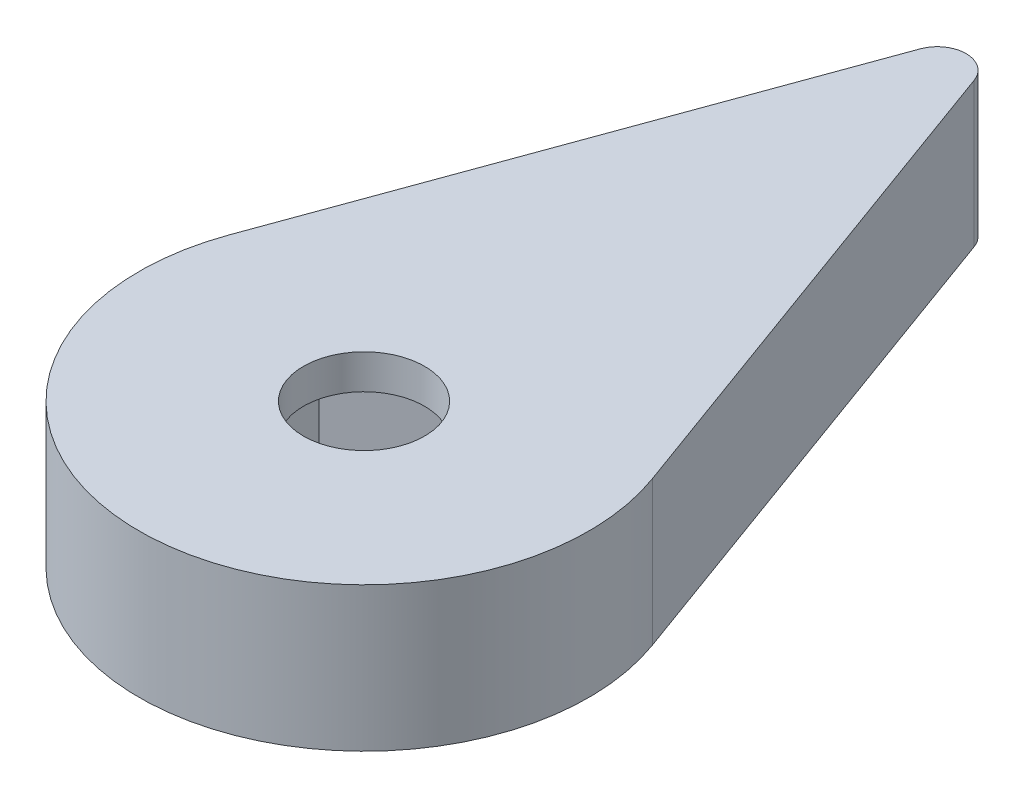
ISO-10303-21;
HEADER;
FILE_DESCRIPTION(('STEP AP214'),'2;1');
FILE_NAME('part.step','',(''),(''),'','','');
FILE_SCHEMA(('AUTOMOTIVE_DESIGN { 1 0 10303 214 1 1 1 1 }'));
ENDSEC;
DATA;
#1=APPLICATION_CONTEXT('core data for automotive mechanical design processes');
#2=APPLICATION_PROTOCOL_DEFINITION('international standard','automotive_design',2000,#1);
#3=PRODUCT_CONTEXT('',#1,'mechanical');
#4=PRODUCT('Part','Part','',(#3));
#5=PRODUCT_RELATED_PRODUCT_CATEGORY('part','',(#4));
#6=PRODUCT_DEFINITION_FORMATION('','',#4);
#7=PRODUCT_DEFINITION_CONTEXT('part definition',#1,'design');
#8=PRODUCT_DEFINITION('design','',#6,#7);
#9=PRODUCT_DEFINITION_SHAPE('','',#8);
#10=(LENGTH_UNIT() NAMED_UNIT(*) SI_UNIT(.MILLI.,.METRE.));
#11=(NAMED_UNIT(*) PLANE_ANGLE_UNIT() SI_UNIT($,.RADIAN.));
#12=(NAMED_UNIT(*) SI_UNIT($,.STERADIAN.) SOLID_ANGLE_UNIT());
#13=UNCERTAINTY_MEASURE_WITH_UNIT(LENGTH_MEASURE(1.E-05),#10,'distance_accuracy_value','');
#14=(GEOMETRIC_REPRESENTATION_CONTEXT(3) GLOBAL_UNCERTAINTY_ASSIGNED_CONTEXT((#13)) GLOBAL_UNIT_ASSIGNED_CONTEXT((#10,
#11,#12)) REPRESENTATION_CONTEXT('',''));
#15=CARTESIAN_POINT('',(0.,0.,0.));
#16=DIRECTION('',(0.,0.,1.));
#17=DIRECTION('',(1.,0.,0.));
#18=AXIS2_PLACEMENT_3D('',#15,#16,#17);
#19=CARTESIAN_POINT('',(0.,-0.00100000000000013,0.));
#20=DIRECTION('',(0.,1.,0.));
#21=DIRECTION('',(0.,0.,1.));
#22=AXIS2_PLACEMENT_3D('',#19,#20,#21);
#23=CYLINDRICAL_SURFACE('',#22,2.1);
#24=CARTESIAN_POINT('',(0.,0.,0.));
#25=DIRECTION('',(0.,1.,0.));
#26=DIRECTION('',(0.,0.,1.));
#27=AXIS2_PLACEMENT_3D('',#24,#25,#26);
#28=CIRCLE('',#27,2.1);
#29=CARTESIAN_POINT('',(0.,0.,2.1));
#30=VERTEX_POINT('',#29);
#31=EDGE_CURVE('E193',#30,#30,#28,.F.);
#32=ORIENTED_EDGE('',*,*,#31,.T.);
#33=EDGE_LOOP('',(#32));
#34=FACE_BOUND('',#33,.T.);
#35=CARTESIAN_POINT('',(0.,0.200000000000001,0.));
#36=DIRECTION('',(0.,1.,0.));
#37=DIRECTION('',(0.,0.,1.));
#38=AXIS2_PLACEMENT_3D('',#35,#36,#37);
#39=CIRCLE('',#38,2.1);
#40=CARTESIAN_POINT('',(0.,0.200000000000001,2.1));
#41=VERTEX_POINT('',#40);
#42=EDGE_CURVE('E45',#41,#41,#39,.F.);
#43=ORIENTED_EDGE('',*,*,#42,.F.);
#44=EDGE_LOOP('',(#43));
#45=FACE_BOUND('',#44,.T.);
#46=ADVANCED_FACE('F41',(#34,#45),#23,.F.);
#47=CARTESIAN_POINT('',(0.,5.,0.));
#48=DIRECTION('',(0.,-1.,0.));
#49=DIRECTION('',(0.,0.,-1.));
#50=AXIS2_PLACEMENT_3D('',#47,#48,#49);
#51=CYLINDRICAL_SURFACE('',#50,7.8);
#52=CARTESIAN_POINT('',(0.,0.,0.));
#53=DIRECTION('',(0.,1.,0.));
#54=DIRECTION('',(0.,0.,1.));
#55=AXIS2_PLACEMENT_3D('',#52,#53,#54);
#56=CIRCLE('',#55,7.8);
#57=CARTESIAN_POINT('',(-7.32960244213009,0.,-2.6677571179402));
#58=VERTEX_POINT('',#57);
#59=CARTESIAN_POINT('',(7.32960244213009,0.,-2.6677571179402));
#60=VERTEX_POINT('',#59);
#61=EDGE_CURVE('E196',#58,#60,#56,.T.);
#62=ORIENTED_EDGE('',*,*,#61,.T.);
#63=DIRECTION('',(0.,-1.,0.));
#64=VECTOR('',#63,1.);
#65=CARTESIAN_POINT('',(7.32960244213009,5.,-2.6677571179402));
#66=LINE('',#65,#64);
#67=CARTESIAN_POINT('',(7.32960244213009,5.,-2.6677571179402));
#68=VERTEX_POINT('',#67);
#69=EDGE_CURVE('E11',#68,#60,#66,.T.);
#70=ORIENTED_EDGE('',*,*,#69,.F.);
#71=CARTESIAN_POINT('',(0.,5.,0.));
#72=DIRECTION('',(0.,1.,0.));
#73=DIRECTION('',(0.,0.,1.));
#74=AXIS2_PLACEMENT_3D('',#71,#72,#73);
#75=CIRCLE('',#74,7.8);
#76=CARTESIAN_POINT('',(-7.32960244213009,5.,-2.6677571179402));
#77=VERTEX_POINT('',#76);
#78=EDGE_CURVE('E197',#77,#68,#75,.T.);
#79=ORIENTED_EDGE('',*,*,#78,.F.);
#80=DIRECTION('',(0.,-1.,0.));
#81=VECTOR('',#80,1.);
#82=CARTESIAN_POINT('',(-7.32960244213009,5.,-2.6677571179402));
#83=LINE('',#82,#81);
#84=EDGE_CURVE('E203',#77,#58,#83,.T.);
#85=ORIENTED_EDGE('',*,*,#84,.T.);
#86=EDGE_LOOP('',(#62,#70,#79,#85));
#87=FACE_BOUND('',#86,.T.);
#88=ADVANCED_FACE('F43',(#87),#51,.T.);
#89=CARTESIAN_POINT('',(7.32960244213009,5.,-2.6677571179402));
#90=DIRECTION('',(-0.939692620785909,0.,0.342020143325666));
#91=DIRECTION('',(0.342020143325666,0.,0.939692620785909));
#92=AXIS2_PLACEMENT_3D('',#89,#90,#91);
#93=PLANE('',#92);
#94=DIRECTION('',(-0.342020143325666,0.,-0.939692620785909));
#95=VECTOR('',#94,1.);
#96=CARTESIAN_POINT('',(7.32960244213009,0.,-2.6677571179402));
#97=LINE('',#96,#95);
#98=CARTESIAN_POINT('',(0.939692556233227,0.,-20.2238902417919));
#99=VERTEX_POINT('',#98);
#100=EDGE_CURVE('E206',#60,#99,#97,.T.);
#101=ORIENTED_EDGE('',*,*,#100,.T.);
#102=DIRECTION('',(0.,-1.,0.));
#103=VECTOR('',#102,1.);
#104=CARTESIAN_POINT('',(0.939692556233227,5.,-20.2238902417919));
#105=LINE('',#104,#103);
#106=CARTESIAN_POINT('',(0.939692556233227,5.,-20.2238902417919));
#107=VERTEX_POINT('',#106);
#108=EDGE_CURVE('E51',#107,#99,#105,.T.);
#109=ORIENTED_EDGE('',*,*,#108,.F.);
#110=DIRECTION('',(-0.342020143325666,0.,-0.939692620785909));
#111=VECTOR('',#110,1.);
#112=CARTESIAN_POINT('',(7.32960244213009,5.,-2.6677571179402));
#113=LINE('',#112,#111);
#114=EDGE_CURVE('E91',#68,#107,#113,.T.);
#115=ORIENTED_EDGE('',*,*,#114,.F.);
#116=ORIENTED_EDGE('',*,*,#69,.T.);
#117=EDGE_LOOP('',(#101,#109,#115,#116));
#118=FACE_BOUND('',#117,.T.);
#119=ADVANCED_FACE('F226',(#118),#93,.F.);
#120=CARTESIAN_POINT('',(0.,5.,-19.8818701219615));
#121=DIRECTION('',(0.,-1.,0.));
#122=DIRECTION('',(0.,0.,-1.));
#123=AXIS2_PLACEMENT_3D('',#120,#121,#122);
#124=CYLINDRICAL_SURFACE('',#123,0.999999931304467);
#125=CARTESIAN_POINT('',(0.,0.,-19.8818701219615));
#126=DIRECTION('',(0.,1.,0.));
#127=DIRECTION('',(0.,0.,1.));
#128=AXIS2_PLACEMENT_3D('',#125,#126,#127);
#129=CIRCLE('',#128,0.999999931304467);
#130=CARTESIAN_POINT('',(-0.939692556233225,0.,-20.2238902417919));
#131=VERTEX_POINT('',#130);
#132=EDGE_CURVE('E78',#99,#131,#129,.T.);
#133=ORIENTED_EDGE('',*,*,#132,.T.);
#134=DIRECTION('',(0.,-1.,0.));
#135=VECTOR('',#134,1.);
#136=CARTESIAN_POINT('',(-0.939692556233225,5.,-20.2238902417919));
#137=LINE('',#136,#135);
#138=CARTESIAN_POINT('',(-0.939692556233225,5.,-20.2238902417919));
#139=VERTEX_POINT('',#138);
#140=EDGE_CURVE('E211',#139,#131,#137,.T.);
#141=ORIENTED_EDGE('',*,*,#140,.F.);
#142=CARTESIAN_POINT('',(0.,5.,-19.8818701219615));
#143=DIRECTION('',(0.,1.,0.));
#144=DIRECTION('',(0.,0.,1.));
#145=AXIS2_PLACEMENT_3D('',#142,#143,#144);
#146=CIRCLE('',#145,0.999999931304467);
#147=EDGE_CURVE('E200',#107,#139,#146,.T.);
#148=ORIENTED_EDGE('',*,*,#147,.F.);
#149=ORIENTED_EDGE('',*,*,#108,.T.);
#150=EDGE_LOOP('',(#133,#141,#148,#149));
#151=FACE_BOUND('',#150,.T.);
#152=ADVANCED_FACE('F251',(#151),#124,.T.);
#153=CARTESIAN_POINT('',(-0.939692556233223,5.,-20.2238902417919));
#154=DIRECTION('',(0.939692620785909,0.,0.342020143325666));
#155=DIRECTION('',(0.342020143325666,0.,-0.93969262078591));
#156=AXIS2_PLACEMENT_3D('',#153,#154,#155);
#157=PLANE('',#156);
#158=DIRECTION('',(-0.342020143325666,0.,0.939692620785909));
#159=VECTOR('',#158,1.);
#160=CARTESIAN_POINT('',(-0.939692556233223,0.,-20.2238902417919));
#161=LINE('',#160,#159);
#162=EDGE_CURVE('E84',#131,#58,#161,.T.);
#163=ORIENTED_EDGE('',*,*,#162,.T.);
#164=ORIENTED_EDGE('',*,*,#84,.F.);
#165=DIRECTION('',(-0.342020143325666,0.,0.939692620785909));
#166=VECTOR('',#165,1.);
#167=CARTESIAN_POINT('',(-0.939692556233223,5.,-20.2238902417919));
#168=LINE('',#167,#166);
#169=EDGE_CURVE('E60',#139,#77,#168,.T.);
#170=ORIENTED_EDGE('',*,*,#169,.F.);
#171=ORIENTED_EDGE('',*,*,#140,.T.);
#172=EDGE_LOOP('',(#163,#164,#170,#171));
#173=FACE_BOUND('',#172,.T.);
#174=ADVANCED_FACE('F245',(#173),#157,.F.);
#175=CARTESIAN_POINT('',(0.,5.,0.));
#176=DIRECTION('',(0.,1.,0.));
#177=DIRECTION('',(0.,0.,1.));
#178=AXIS2_PLACEMENT_3D('',#175,#176,#177);
#179=PLANE('',#178);
#180=CARTESIAN_POINT('',(0.,5.,0.));
#181=DIRECTION('',(0.,1.,0.));
#182=DIRECTION('',(0.,0.,1.));
#183=AXIS2_PLACEMENT_3D('',#180,#181,#182);
#184=CIRCLE('',#183,2.1);
#185=CARTESIAN_POINT('',(0.,5.,2.1));
#186=VERTEX_POINT('',#185);
#187=EDGE_CURVE('E190',#186,#186,#184,.T.);
#188=ORIENTED_EDGE('',*,*,#187,.F.);
#189=EDGE_LOOP('',(#188));
#190=FACE_BOUND('',#189,.T.);
#191=ORIENTED_EDGE('',*,*,#78,.T.);
#192=ORIENTED_EDGE('',*,*,#114,.T.);
#193=ORIENTED_EDGE('',*,*,#147,.T.);
#194=ORIENTED_EDGE('',*,*,#169,.T.);
#195=EDGE_LOOP('',(#191,#192,#193,#194));
#196=FACE_BOUND('',#195,.T.);
#197=ADVANCED_FACE('F238',(#190,#196),#179,.T.);
#198=CARTESIAN_POINT('',(0.,0.,0.));
#199=DIRECTION('',(0.,1.,0.));
#200=DIRECTION('',(0.,0.,1.));
#201=AXIS2_PLACEMENT_3D('',#198,#199,#200);
#202=PLANE('',#201);
#203=ORIENTED_EDGE('',*,*,#31,.F.);
#204=EDGE_LOOP('',(#203));
#205=FACE_BOUND('',#204,.T.);
#206=ORIENTED_EDGE('',*,*,#61,.F.);
#207=ORIENTED_EDGE('',*,*,#162,.F.);
#208=ORIENTED_EDGE('',*,*,#132,.F.);
#209=ORIENTED_EDGE('',*,*,#100,.F.);
#210=EDGE_LOOP('',(#206,#207,#208,#209));
#211=FACE_BOUND('',#210,.T.);
#212=ADVANCED_FACE('F231',(#205,#211),#202,.F.);
#213=CARTESIAN_POINT('',(0.,3.8,0.));
#214=DIRECTION('',(0.,1.,0.));
#215=DIRECTION('',(0.,0.,1.));
#216=AXIS2_PLACEMENT_3D('',#213,#214,#215);
#217=CIRCLE('',#216,2.1);
#218=CARTESIAN_POINT('',(0.,3.8,2.1));
#219=VERTEX_POINT('',#218);
#220=EDGE_CURVE('E182',#219,#219,#217,.F.);
#221=ORIENTED_EDGE('',*,*,#220,.T.);
#222=EDGE_LOOP('',(#221));
#223=FACE_BOUND('',#222,.T.);
#224=ORIENTED_EDGE('',*,*,#187,.T.);
#225=EDGE_LOOP('',(#224));
#226=FACE_BOUND('',#225,.T.);
#227=ADVANCED_FACE('F222',(#223,#226),#23,.F.);
#228=CARTESIAN_POINT('',(0.,0.200000000000001,0.));
#229=DIRECTION('',(0.,1.,0.));
#230=DIRECTION('',(0.,0.,1.));
#231=AXIS2_PLACEMENT_3D('',#228,#229,#230);
#232=PLANE('',#231);
#233=DIRECTION('',(-0.866025403784439,0.,-0.5));
#234=VECTOR('',#233,1.);
#235=CARTESIAN_POINT('',(3.7,0.200000000000001,-2.13619599600162));
#236=LINE('',#235,#234);
#237=CARTESIAN_POINT('',(3.7,0.200000000000001,-2.13619599600162));
#238=VERTEX_POINT('',#237);
#239=CARTESIAN_POINT('',(0.,0.200000000000001,-4.27239199200323));
#240=VERTEX_POINT('',#239);
#241=EDGE_CURVE('E134',#238,#240,#236,.T.);
#242=ORIENTED_EDGE('',*,*,#241,.T.);
#243=DIRECTION('',(-0.866025403784439,0.,0.5));
#244=VECTOR('',#243,1.);
#245=CARTESIAN_POINT('',(0.,0.200000000000001,-4.27239199200323));
#246=LINE('',#245,#244);
#247=CARTESIAN_POINT('',(-3.7,0.200000000000001,-2.13619599600162));
#248=VERTEX_POINT('',#247);
#249=EDGE_CURVE('E145',#240,#248,#246,.T.);
#250=ORIENTED_EDGE('',*,*,#249,.T.);
#251=DIRECTION('',(0.,0.,1.));
#252=VECTOR('',#251,1.);
#253=CARTESIAN_POINT('',(-3.7,0.200000000000001,-2.13619599600162));
#254=LINE('',#253,#252);
#255=CARTESIAN_POINT('',(-3.7,0.200000000000001,2.13619599600162));
#256=VERTEX_POINT('',#255);
#257=EDGE_CURVE('E150',#248,#256,#254,.T.);
#258=ORIENTED_EDGE('',*,*,#257,.T.);
#259=DIRECTION('',(0.866025403784439,0.,0.5));
#260=VECTOR('',#259,1.);
#261=CARTESIAN_POINT('',(-3.7,0.200000000000001,2.13619599600162));
#262=LINE('',#261,#260);
#263=CARTESIAN_POINT('',(0.,0.200000000000001,4.27239199200323));
#264=VERTEX_POINT('',#263);
#265=EDGE_CURVE('E163',#256,#264,#262,.T.);
#266=ORIENTED_EDGE('',*,*,#265,.T.);
#267=DIRECTION('',(0.866025403784439,0.,-0.5));
#268=VECTOR('',#267,1.);
#269=CARTESIAN_POINT('',(0.,0.200000000000001,4.27239199200323));
#270=LINE('',#269,#268);
#271=CARTESIAN_POINT('',(3.7,0.200000000000001,2.13619599600162));
#272=VERTEX_POINT('',#271);
#273=EDGE_CURVE('E166',#264,#272,#270,.T.);
#274=ORIENTED_EDGE('',*,*,#273,.T.);
#275=DIRECTION('',(0.,0.,-1.));
#276=VECTOR('',#275,1.);
#277=CARTESIAN_POINT('',(3.7,0.200000000000001,2.13619599600162));
#278=LINE('',#277,#276);
#279=EDGE_CURVE('E142',#272,#238,#278,.T.);
#280=ORIENTED_EDGE('',*,*,#279,.T.);
#281=EDGE_LOOP('',(#242,#250,#258,#266,#274,#280));
#282=FACE_BOUND('',#281,.T.);
#283=ORIENTED_EDGE('',*,*,#42,.T.);
#284=EDGE_LOOP('',(#283));
#285=FACE_BOUND('',#284,.T.);
#286=ADVANCED_FACE('F152',(#282,#285),#232,.T.);
#287=CARTESIAN_POINT('',(0.,3.8,0.));
#288=DIRECTION('',(0.,1.,0.));
#289=DIRECTION('',(0.,0.,1.));
#290=AXIS2_PLACEMENT_3D('',#287,#288,#289);
#291=PLANE('',#290);
#292=DIRECTION('',(-0.866025403784439,0.,-0.5));
#293=VECTOR('',#292,1.);
#294=CARTESIAN_POINT('',(3.7,3.8,-2.13619599600162));
#295=LINE('',#294,#293);
#296=CARTESIAN_POINT('',(3.7,3.8,-2.13619599600162));
#297=VERTEX_POINT('',#296);
#298=CARTESIAN_POINT('',(0.,3.8,-4.27239199200323));
#299=VERTEX_POINT('',#298);
#300=EDGE_CURVE('E137',#297,#299,#295,.T.);
#301=ORIENTED_EDGE('',*,*,#300,.F.);
#302=DIRECTION('',(0.,0.,-1.));
#303=VECTOR('',#302,1.);
#304=CARTESIAN_POINT('',(3.7,3.8,2.13619599600162));
#305=LINE('',#304,#303);
#306=CARTESIAN_POINT('',(3.7,3.8,2.13619599600162));
#307=VERTEX_POINT('',#306);
#308=EDGE_CURVE('E156',#307,#297,#305,.T.);
#309=ORIENTED_EDGE('',*,*,#308,.F.);
#310=DIRECTION('',(0.866025403784439,0.,-0.5));
#311=VECTOR('',#310,1.);
#312=CARTESIAN_POINT('',(0.,3.8,4.27239199200323));
#313=LINE('',#312,#311);
#314=CARTESIAN_POINT('',(0.,3.8,4.27239199200323));
#315=VERTEX_POINT('',#314);
#316=EDGE_CURVE('E159',#315,#307,#313,.T.);
#317=ORIENTED_EDGE('',*,*,#316,.F.);
#318=DIRECTION('',(0.866025403784439,0.,0.5));
#319=VECTOR('',#318,1.);
#320=CARTESIAN_POINT('',(-3.7,3.8,2.13619599600162));
#321=LINE('',#320,#319);
#322=CARTESIAN_POINT('',(-3.7,3.8,2.13619599600162));
#323=VERTEX_POINT('',#322);
#324=EDGE_CURVE('E175',#323,#315,#321,.T.);
#325=ORIENTED_EDGE('',*,*,#324,.F.);
#326=DIRECTION('',(0.,0.,1.));
#327=VECTOR('',#326,1.);
#328=CARTESIAN_POINT('',(-3.7,3.8,-2.13619599600162));
#329=LINE('',#328,#327);
#330=CARTESIAN_POINT('',(-3.7,3.8,-2.13619599600162));
#331=VERTEX_POINT('',#330);
#332=EDGE_CURVE('E172',#331,#323,#329,.T.);
#333=ORIENTED_EDGE('',*,*,#332,.F.);
#334=DIRECTION('',(-0.866025403784439,0.,0.5));
#335=VECTOR('',#334,1.);
#336=CARTESIAN_POINT('',(0.,3.8,-4.27239199200323));
#337=LINE('',#336,#335);
#338=EDGE_CURVE('E170',#299,#331,#337,.T.);
#339=ORIENTED_EDGE('',*,*,#338,.F.);
#340=EDGE_LOOP('',(#301,#309,#317,#325,#333,#339));
#341=FACE_BOUND('',#340,.T.);
#342=ORIENTED_EDGE('',*,*,#220,.F.);
#343=EDGE_LOOP('',(#342));
#344=FACE_BOUND('',#343,.T.);
#345=ADVANCED_FACE('F236',(#341,#344),#291,.F.);
#346=CARTESIAN_POINT('',(3.7,0.200000000000001,-2.13619599600162));
#347=DIRECTION('',(0.5,0.,-0.866025403784439));
#348=DIRECTION('',(-0.866025403784439,0.,-0.5));
#349=AXIS2_PLACEMENT_3D('',#346,#347,#348);
#350=PLANE('',#349);
#351=ORIENTED_EDGE('',*,*,#300,.T.);
#352=DIRECTION('',(0.,1.,0.));
#353=VECTOR('',#352,1.);
#354=CARTESIAN_POINT('',(0.,0.200000000000001,-4.27239199200323));
#355=LINE('',#354,#353);
#356=EDGE_CURVE('E130',#240,#299,#355,.T.);
#357=ORIENTED_EDGE('',*,*,#356,.F.);
#358=ORIENTED_EDGE('',*,*,#241,.F.);
#359=DIRECTION('',(0.,1.,0.));
#360=VECTOR('',#359,1.);
#361=CARTESIAN_POINT('',(3.7,0.200000000000001,-2.13619599600162));
#362=LINE('',#361,#360);
#363=EDGE_CURVE('E180',#238,#297,#362,.T.);
#364=ORIENTED_EDGE('',*,*,#363,.T.);
#365=EDGE_LOOP('',(#351,#357,#358,#364));
#366=FACE_BOUND('',#365,.T.);
#367=ADVANCED_FACE('F132',(#366),#350,.F.);
#368=CARTESIAN_POINT('',(3.7,0.200000000000001,2.13619599600162));
#369=DIRECTION('',(1.,0.,0.));
#370=DIRECTION('',(0.,0.,-1.));
#371=AXIS2_PLACEMENT_3D('',#368,#369,#370);
#372=PLANE('',#371);
#373=ORIENTED_EDGE('',*,*,#308,.T.);
#374=ORIENTED_EDGE('',*,*,#363,.F.);
#375=ORIENTED_EDGE('',*,*,#279,.F.);
#376=DIRECTION('',(0.,1.,0.));
#377=VECTOR('',#376,1.);
#378=CARTESIAN_POINT('',(3.7,0.200000000000001,2.13619599600162));
#379=LINE('',#378,#377);
#380=EDGE_CURVE('E183',#272,#307,#379,.T.);
#381=ORIENTED_EDGE('',*,*,#380,.T.);
#382=EDGE_LOOP('',(#373,#374,#375,#381));
#383=FACE_BOUND('',#382,.T.);
#384=ADVANCED_FACE('F323',(#383),#372,.F.);
#385=CARTESIAN_POINT('',(0.,0.200000000000001,4.27239199200323));
#386=DIRECTION('',(0.5,0.,0.866025403784439));
#387=DIRECTION('',(0.866025403784439,0.,-0.5));
#388=AXIS2_PLACEMENT_3D('',#385,#386,#387);
#389=PLANE('',#388);
#390=ORIENTED_EDGE('',*,*,#316,.T.);
#391=ORIENTED_EDGE('',*,*,#380,.F.);
#392=ORIENTED_EDGE('',*,*,#273,.F.);
#393=DIRECTION('',(0.,1.,0.));
#394=VECTOR('',#393,1.);
#395=CARTESIAN_POINT('',(0.,0.200000000000001,4.27239199200323));
#396=LINE('',#395,#394);
#397=EDGE_CURVE('E185',#264,#315,#396,.T.);
#398=ORIENTED_EDGE('',*,*,#397,.T.);
#399=EDGE_LOOP('',(#390,#391,#392,#398));
#400=FACE_BOUND('',#399,.T.);
#401=ADVANCED_FACE('F332',(#400),#389,.F.);
#402=CARTESIAN_POINT('',(-3.7,0.200000000000001,2.13619599600162));
#403=DIRECTION('',(-0.5,0.,0.866025403784438));
#404=DIRECTION('',(0.866025403784439,0.,0.5));
#405=AXIS2_PLACEMENT_3D('',#402,#403,#404);
#406=PLANE('',#405);
#407=ORIENTED_EDGE('',*,*,#324,.T.);
#408=ORIENTED_EDGE('',*,*,#397,.F.);
#409=ORIENTED_EDGE('',*,*,#265,.F.);
#410=DIRECTION('',(0.,1.,0.));
#411=VECTOR('',#410,1.);
#412=CARTESIAN_POINT('',(-3.7,0.200000000000001,2.13619599600162));
#413=LINE('',#412,#411);
#414=EDGE_CURVE('E187',#256,#323,#413,.T.);
#415=ORIENTED_EDGE('',*,*,#414,.T.);
#416=EDGE_LOOP('',(#407,#408,#409,#415));
#417=FACE_BOUND('',#416,.T.);
#418=ADVANCED_FACE('F343',(#417),#406,.F.);
#419=CARTESIAN_POINT('',(-3.7,0.200000000000001,-2.13619599600162));
#420=DIRECTION('',(-1.,0.,0.));
#421=DIRECTION('',(0.,0.,1.));
#422=AXIS2_PLACEMENT_3D('',#419,#420,#421);
#423=PLANE('',#422);
#424=ORIENTED_EDGE('',*,*,#332,.T.);
#425=ORIENTED_EDGE('',*,*,#414,.F.);
#426=ORIENTED_EDGE('',*,*,#257,.F.);
#427=DIRECTION('',(0.,1.,0.));
#428=VECTOR('',#427,1.);
#429=CARTESIAN_POINT('',(-3.7,0.200000000000001,-2.13619599600162));
#430=LINE('',#429,#428);
#431=EDGE_CURVE('E141',#248,#331,#430,.T.);
#432=ORIENTED_EDGE('',*,*,#431,.T.);
#433=EDGE_LOOP('',(#424,#425,#426,#432));
#434=FACE_BOUND('',#433,.T.);
#435=ADVANCED_FACE('F354',(#434),#423,.F.);
#436=CARTESIAN_POINT('',(0.,0.200000000000001,-4.27239199200323));
#437=DIRECTION('',(-0.5,0.,-0.866025403784439));
#438=DIRECTION('',(-0.866025403784439,0.,0.5));
#439=AXIS2_PLACEMENT_3D('',#436,#437,#438);
#440=PLANE('',#439);
#441=ORIENTED_EDGE('',*,*,#338,.T.);
#442=ORIENTED_EDGE('',*,*,#431,.F.);
#443=ORIENTED_EDGE('',*,*,#249,.F.);
#444=ORIENTED_EDGE('',*,*,#356,.T.);
#445=EDGE_LOOP('',(#441,#442,#443,#444));
#446=FACE_BOUND('',#445,.T.);
#447=ADVANCED_FACE('F146',(#446),#440,.F.);
#448=CLOSED_SHELL('',(#46,#88,#119,#152,#174,#197,#212,#227,#286,#345,#367,#384,#401,#418,#435,#447));
#449=MANIFOLD_SOLID_BREP('B2',#448);
#450=ADVANCED_BREP_SHAPE_REPRESENTATION('',(#18,#449),#14);
#451=SHAPE_DEFINITION_REPRESENTATION(#9,#450);
ENDSEC;
END-ISO-10303-21;
